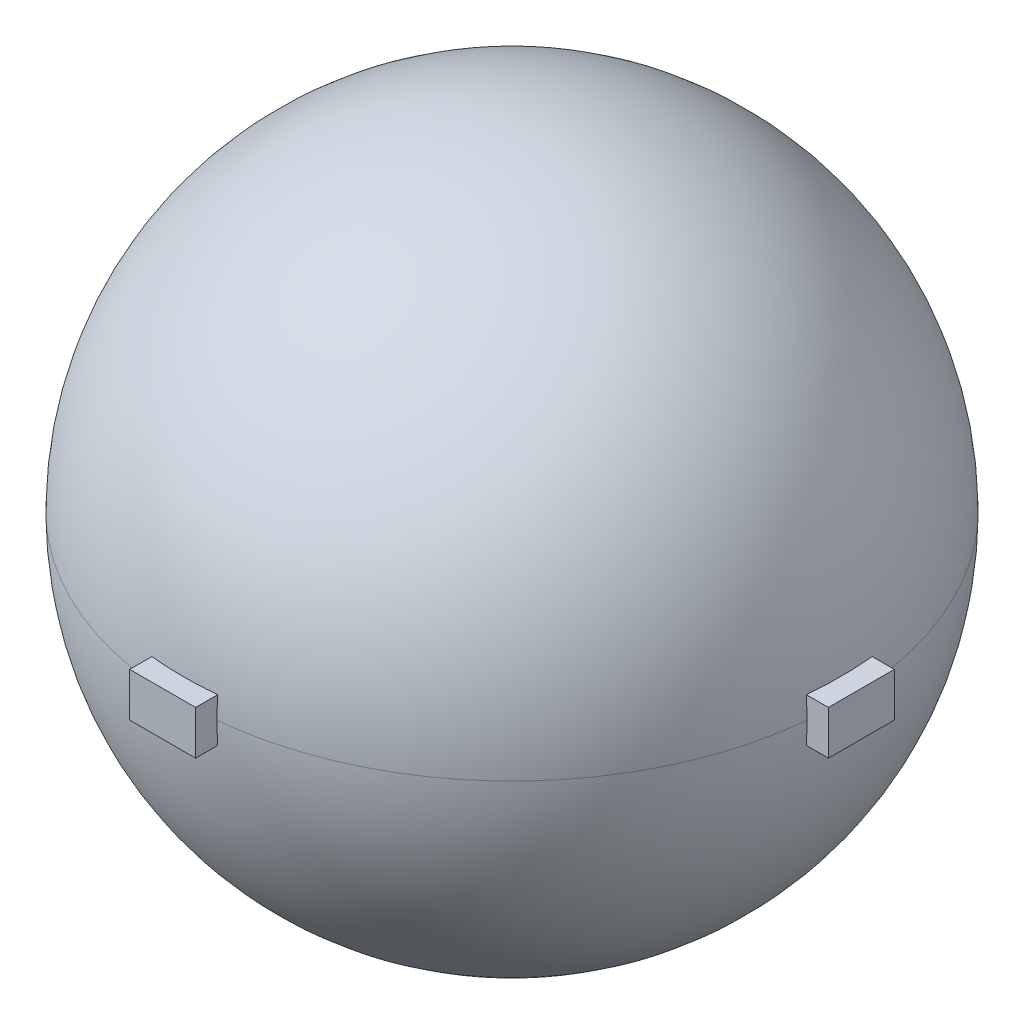
ISO-10303-21;
HEADER;
FILE_DESCRIPTION(('STEP AP214'),'2;1');
FILE_NAME('part.step','',(''),(''),'','','');
FILE_SCHEMA(('AUTOMOTIVE_DESIGN { 1 0 10303 214 1 1 1 1 }'));
ENDSEC;
DATA;
#1=APPLICATION_CONTEXT('core data for automotive mechanical design processes');
#2=APPLICATION_PROTOCOL_DEFINITION('international standard','automotive_design',2000,#1);
#3=PRODUCT_CONTEXT('',#1,'mechanical');
#4=PRODUCT('Part','Part','',(#3));
#5=PRODUCT_RELATED_PRODUCT_CATEGORY('part','',(#4));
#6=PRODUCT_DEFINITION_FORMATION('','',#4);
#7=PRODUCT_DEFINITION_CONTEXT('part definition',#1,'design');
#8=PRODUCT_DEFINITION('design','',#6,#7);
#9=PRODUCT_DEFINITION_SHAPE('','',#8);
#10=(LENGTH_UNIT() NAMED_UNIT(*) SI_UNIT(.MILLI.,.METRE.));
#11=(NAMED_UNIT(*) PLANE_ANGLE_UNIT() SI_UNIT($,.RADIAN.));
#12=(NAMED_UNIT(*) SI_UNIT($,.STERADIAN.) SOLID_ANGLE_UNIT());
#13=UNCERTAINTY_MEASURE_WITH_UNIT(LENGTH_MEASURE(1.E-05),#10,'distance_accuracy_value','');
#14=(GEOMETRIC_REPRESENTATION_CONTEXT(3) GLOBAL_UNCERTAINTY_ASSIGNED_CONTEXT((#13)) GLOBAL_UNIT_ASSIGNED_CONTEXT((#10,
#11,#12)) REPRESENTATION_CONTEXT('',''));
#15=CARTESIAN_POINT('',(0.,0.,0.));
#16=DIRECTION('',(0.,0.,1.));
#17=DIRECTION('',(1.,0.,0.));
#18=AXIS2_PLACEMENT_3D('',#15,#16,#17);
#19=CARTESIAN_POINT('',(0.,381.,0.));
#20=DIRECTION('',(0.,1.,0.));
#21=DIRECTION('',(0.,0.,1.));
#22=AXIS2_PLACEMENT_3D('',#19,#20,#21);
#23=SPHERICAL_SURFACE('',#22,381.);
#24=CARTESIAN_POINT('',(0.,381.,0.));
#25=DIRECTION('',(0.,-1.,0.));
#26=DIRECTION('',(0.,0.,-1.));
#27=AXIS2_PLACEMENT_3D('',#24,#25,#26);
#28=CIRCLE('',#27,381.);
#29=CARTESIAN_POINT('',(38.1,381.,-379.090213537622));
#30=VERTEX_POINT('',#29);
#31=CARTESIAN_POINT('',(379.090213537622,381.,-38.0999999999999));
#32=VERTEX_POINT('',#31);
#33=EDGE_CURVE('E300',#30,#32,#28,.T.);
#34=ORIENTED_EDGE('',*,*,#33,.F.);
#35=CARTESIAN_POINT('',(38.1,381.,0.));
#36=DIRECTION('',(-1.,0.,0.));
#37=DIRECTION('',(0.,0.,1.));
#38=AXIS2_PLACEMENT_3D('',#35,#36,#37);
#39=CIRCLE('',#38,379.090213537622);
#40=CARTESIAN_POINT('',(38.1,406.4,-378.23832434062));
#41=VERTEX_POINT('',#40);
#42=EDGE_CURVE('E202',#41,#30,#39,.T.);
#43=ORIENTED_EDGE('',*,*,#42,.F.);
#44=CARTESIAN_POINT('',(0.,406.4,0.));
#45=DIRECTION('',(0.,-1.,0.));
#46=DIRECTION('',(0.,0.,-1.));
#47=AXIS2_PLACEMENT_3D('',#44,#45,#46);
#48=CIRCLE('',#47,380.152390496232);
#49=CARTESIAN_POINT('',(-38.1,406.4,-378.23832434062));
#50=VERTEX_POINT('',#49);
#51=EDGE_CURVE('E195',#50,#41,#48,.T.);
#52=ORIENTED_EDGE('',*,*,#51,.F.);
#53=CARTESIAN_POINT('',(-38.1,381.,0.));
#54=DIRECTION('',(1.,0.,0.));
#55=DIRECTION('',(0.,0.,-1.));
#56=AXIS2_PLACEMENT_3D('',#53,#54,#55);
#57=CIRCLE('',#56,379.090213537622);
#58=CARTESIAN_POINT('',(-38.1,381.,-379.090213537622));
#59=VERTEX_POINT('',#58);
#60=EDGE_CURVE('E179',#59,#50,#57,.T.);
#61=ORIENTED_EDGE('',*,*,#60,.F.);
#62=CARTESIAN_POINT('',(-379.090213537622,381.,-38.0999999999999));
#63=VERTEX_POINT('',#62);
#64=EDGE_CURVE('E312',#63,#59,#28,.T.);
#65=ORIENTED_EDGE('',*,*,#64,.F.);
#66=CARTESIAN_POINT('',(0.,381.,-38.0999999999999));
#67=DIRECTION('',(0.,0.,1.));
#68=DIRECTION('',(1.,0.,0.));
#69=AXIS2_PLACEMENT_3D('',#66,#67,#68);
#70=CIRCLE('',#69,379.090213537622);
#71=CARTESIAN_POINT('',(-378.23832434062,406.4,-38.0999999999999));
#72=VERTEX_POINT('',#71);
#73=EDGE_CURVE('E253',#72,#63,#70,.T.);
#74=ORIENTED_EDGE('',*,*,#73,.F.);
#75=CARTESIAN_POINT('',(0.,406.4,0.));
#76=DIRECTION('',(0.,-1.,0.));
#77=DIRECTION('',(0.,0.,-1.));
#78=AXIS2_PLACEMENT_3D('',#75,#76,#77);
#79=CIRCLE('',#78,380.152390496232);
#80=CARTESIAN_POINT('',(-378.23832434062,406.4,38.1000000000001));
#81=VERTEX_POINT('',#80);
#82=EDGE_CURVE('E249',#81,#72,#79,.T.);
#83=ORIENTED_EDGE('',*,*,#82,.F.);
#84=CARTESIAN_POINT('',(0.,381.,38.1000000000001));
#85=DIRECTION('',(0.,0.,-1.));
#86=DIRECTION('',(-1.,0.,0.));
#87=AXIS2_PLACEMENT_3D('',#84,#85,#86);
#88=CIRCLE('',#87,379.090213537622);
#89=CARTESIAN_POINT('',(-379.090213537622,381.,38.1000000000001));
#90=VERTEX_POINT('',#89);
#91=EDGE_CURVE('E250',#90,#81,#88,.T.);
#92=ORIENTED_EDGE('',*,*,#91,.F.);
#93=CARTESIAN_POINT('',(-38.1,381.,379.090213537622));
#94=VERTEX_POINT('',#93);
#95=EDGE_CURVE('E311',#94,#90,#28,.T.);
#96=ORIENTED_EDGE('',*,*,#95,.F.);
#97=CARTESIAN_POINT('',(-38.1,381.,0.));
#98=DIRECTION('',(-1.,0.,0.));
#99=DIRECTION('',(0.,0.,1.));
#100=AXIS2_PLACEMENT_3D('',#97,#98,#99);
#101=CIRCLE('',#100,379.090213537622);
#102=CARTESIAN_POINT('',(-38.1,406.4,378.23832434062));
#103=VERTEX_POINT('',#102);
#104=EDGE_CURVE('E64',#94,#103,#101,.T.);
#105=ORIENTED_EDGE('',*,*,#104,.T.);
#106=CARTESIAN_POINT('',(0.,406.4,0.));
#107=DIRECTION('',(0.,1.,0.));
#108=DIRECTION('',(0.,0.,1.));
#109=AXIS2_PLACEMENT_3D('',#106,#107,#108);
#110=CIRCLE('',#109,380.152390496232);
#111=CARTESIAN_POINT('',(38.1,406.4,378.23832434062));
#112=VERTEX_POINT('',#111);
#113=EDGE_CURVE('E223',#103,#112,#110,.T.);
#114=ORIENTED_EDGE('',*,*,#113,.T.);
#115=CARTESIAN_POINT('',(38.1,381.,0.));
#116=DIRECTION('',(1.,0.,0.));
#117=DIRECTION('',(0.,0.,-1.));
#118=AXIS2_PLACEMENT_3D('',#115,#116,#117);
#119=CIRCLE('',#118,379.090213537622);
#120=CARTESIAN_POINT('',(38.1,381.,379.090213537622));
#121=VERTEX_POINT('',#120);
#122=EDGE_CURVE('E220',#112,#121,#119,.T.);
#123=ORIENTED_EDGE('',*,*,#122,.T.);
#124=CARTESIAN_POINT('',(379.090213537622,381.,38.1000000000001));
#125=VERTEX_POINT('',#124);
#126=EDGE_CURVE('E308',#125,#121,#28,.T.);
#127=ORIENTED_EDGE('',*,*,#126,.F.);
#128=CARTESIAN_POINT('',(0.,381.,38.1000000000001));
#129=DIRECTION('',(0.,0.,1.));
#130=DIRECTION('',(1.,0.,0.));
#131=AXIS2_PLACEMENT_3D('',#128,#129,#130);
#132=CIRCLE('',#131,379.090213537622);
#133=CARTESIAN_POINT('',(378.23832434062,406.4,38.1000000000001));
#134=VERTEX_POINT('',#133);
#135=EDGE_CURVE('E303',#125,#134,#132,.T.);
#136=ORIENTED_EDGE('',*,*,#135,.T.);
#137=CARTESIAN_POINT('',(0.,406.4,0.));
#138=DIRECTION('',(0.,1.,0.));
#139=DIRECTION('',(0.,0.,1.));
#140=AXIS2_PLACEMENT_3D('',#137,#138,#139);
#141=CIRCLE('',#140,380.152390496232);
#142=CARTESIAN_POINT('',(378.23832434062,406.4,-38.0999999999999));
#143=VERTEX_POINT('',#142);
#144=EDGE_CURVE('E298',#134,#143,#141,.T.);
#145=ORIENTED_EDGE('',*,*,#144,.T.);
#146=CARTESIAN_POINT('',(0.,381.,-38.0999999999999));
#147=DIRECTION('',(0.,0.,-1.));
#148=DIRECTION('',(-1.,0.,0.));
#149=AXIS2_PLACEMENT_3D('',#146,#147,#148);
#150=CIRCLE('',#149,379.090213537622);
#151=EDGE_CURVE('E281',#143,#32,#150,.T.);
#152=ORIENTED_EDGE('',*,*,#151,.T.);
#153=EDGE_LOOP('',(#34,#43,#52,#61,#65,#74,#83,#92,#96,#105,#114,#123,#127,#136,#145,#152));
#154=FACE_BOUND('',#153,.T.);
#155=ADVANCED_FACE('F40',(#154),#23,.T.);
#156=CARTESIAN_POINT('',(0.,381.,0.));
#157=DIRECTION('',(0.,1.,0.));
#158=DIRECTION('',(0.,0.,1.));
#159=AXIS2_PLACEMENT_3D('',#156,#157,#158);
#160=SPHERICAL_SURFACE('',#159,381.);
#161=CARTESIAN_POINT('',(0.,355.6,0.));
#162=DIRECTION('',(0.,1.,0.));
#163=DIRECTION('',(0.,0.,1.));
#164=AXIS2_PLACEMENT_3D('',#161,#162,#163);
#165=CIRCLE('',#164,380.152390496232);
#166=CARTESIAN_POINT('',(38.1,355.6,-378.23832434062));
#167=VERTEX_POINT('',#166);
#168=CARTESIAN_POINT('',(-38.1,355.6,-378.23832434062));
#169=VERTEX_POINT('',#168);
#170=EDGE_CURVE('E56',#167,#169,#165,.T.);
#171=ORIENTED_EDGE('',*,*,#170,.F.);
#172=CARTESIAN_POINT('',(38.1,381.,0.));
#173=DIRECTION('',(-1.,0.,0.));
#174=DIRECTION('',(0.,0.,1.));
#175=AXIS2_PLACEMENT_3D('',#172,#173,#174);
#176=CIRCLE('',#175,379.090213537622);
#177=EDGE_CURVE('E11',#167,#30,#176,.F.);
#178=ORIENTED_EDGE('',*,*,#177,.T.);
#179=ORIENTED_EDGE('',*,*,#33,.T.);
#180=CARTESIAN_POINT('',(0.,381.,-38.0999999999999));
#181=DIRECTION('',(0.,0.,-1.));
#182=DIRECTION('',(-1.,0.,0.));
#183=AXIS2_PLACEMENT_3D('',#180,#181,#182);
#184=CIRCLE('',#183,379.090213537622);
#185=CARTESIAN_POINT('',(378.23832434062,355.6,-38.0999999999999));
#186=VERTEX_POINT('',#185);
#187=EDGE_CURVE('E315',#186,#32,#184,.F.);
#188=ORIENTED_EDGE('',*,*,#187,.F.);
#189=CARTESIAN_POINT('',(0.,355.6,0.));
#190=DIRECTION('',(0.,-1.,0.));
#191=DIRECTION('',(0.,0.,-1.));
#192=AXIS2_PLACEMENT_3D('',#189,#190,#191);
#193=CIRCLE('',#192,380.152390496232);
#194=CARTESIAN_POINT('',(378.23832434062,355.6,38.1000000000001));
#195=VERTEX_POINT('',#194);
#196=EDGE_CURVE('E304',#186,#195,#193,.T.);
#197=ORIENTED_EDGE('',*,*,#196,.T.);
#198=EDGE_CURVE('E301',#195,#125,#132,.T.);
#199=ORIENTED_EDGE('',*,*,#198,.T.);
#200=ORIENTED_EDGE('',*,*,#126,.T.);
#201=CARTESIAN_POINT('',(38.1,381.,0.));
#202=DIRECTION('',(1.,0.,0.));
#203=DIRECTION('',(0.,0.,-1.));
#204=AXIS2_PLACEMENT_3D('',#201,#202,#203);
#205=CIRCLE('',#204,379.090213537622);
#206=CARTESIAN_POINT('',(38.1,355.6,378.23832434062));
#207=VERTEX_POINT('',#206);
#208=EDGE_CURVE('E49',#207,#121,#205,.F.);
#209=ORIENTED_EDGE('',*,*,#208,.F.);
#210=CARTESIAN_POINT('',(0.,355.6,0.));
#211=DIRECTION('',(0.,-1.,0.));
#212=DIRECTION('',(0.,0.,-1.));
#213=AXIS2_PLACEMENT_3D('',#210,#211,#212);
#214=CIRCLE('',#213,380.152390496232);
#215=CARTESIAN_POINT('',(-38.1,355.6,378.23832434062));
#216=VERTEX_POINT('',#215);
#217=EDGE_CURVE('E218',#207,#216,#214,.T.);
#218=ORIENTED_EDGE('',*,*,#217,.T.);
#219=EDGE_CURVE('E216',#216,#94,#101,.T.);
#220=ORIENTED_EDGE('',*,*,#219,.T.);
#221=ORIENTED_EDGE('',*,*,#95,.T.);
#222=CARTESIAN_POINT('',(-378.23832434062,355.6,38.1000000000001));
#223=VERTEX_POINT('',#222);
#224=EDGE_CURVE('E246',#223,#90,#88,.T.);
#225=ORIENTED_EDGE('',*,*,#224,.F.);
#226=CARTESIAN_POINT('',(0.,355.6,0.));
#227=DIRECTION('',(0.,1.,0.));
#228=DIRECTION('',(0.,0.,1.));
#229=AXIS2_PLACEMENT_3D('',#226,#227,#228);
#230=CIRCLE('',#229,380.152390496232);
#231=CARTESIAN_POINT('',(-378.23832434062,355.6,-38.0999999999999));
#232=VERTEX_POINT('',#231);
#233=EDGE_CURVE('E270',#232,#223,#230,.T.);
#234=ORIENTED_EDGE('',*,*,#233,.F.);
#235=CARTESIAN_POINT('',(0.,381.,-38.0999999999999));
#236=DIRECTION('',(0.,0.,1.));
#237=DIRECTION('',(1.,0.,0.));
#238=AXIS2_PLACEMENT_3D('',#235,#236,#237);
#239=CIRCLE('',#238,379.090213537622);
#240=EDGE_CURVE('E318',#232,#63,#239,.F.);
#241=ORIENTED_EDGE('',*,*,#240,.T.);
#242=ORIENTED_EDGE('',*,*,#64,.T.);
#243=EDGE_CURVE('E186',#169,#59,#57,.T.);
#244=ORIENTED_EDGE('',*,*,#243,.F.);
#245=EDGE_LOOP('',(#171,#178,#179,#188,#197,#199,#200,#209,#218,#220,#221,#225,#234,#241,#242,#244));
#246=FACE_BOUND('',#245,.T.);
#247=ADVANCED_FACE('F329',(#246),#160,.T.);
#248=CARTESIAN_POINT('',(-381.001,355.6,-38.0999999999999));
#249=DIRECTION('',(0.,0.,-1.));
#250=DIRECTION('',(-1.,0.,0.));
#251=AXIS2_PLACEMENT_3D('',#248,#249,#250);
#252=PLANE('',#251);
#253=ORIENTED_EDGE('',*,*,#151,.F.);
#254=DIRECTION('',(1.,0.,0.));
#255=VECTOR('',#254,1.);
#256=CARTESIAN_POINT('',(-381.001,406.4,-38.0999999999999));
#257=LINE('',#256,#255);
#258=CARTESIAN_POINT('',(403.86,406.4,-38.0999999999999));
#259=VERTEX_POINT('',#258);
#260=EDGE_CURVE('E255',#143,#259,#257,.T.);
#261=ORIENTED_EDGE('',*,*,#260,.T.);
#262=DIRECTION('',(0.,1.,0.));
#263=VECTOR('',#262,1.);
#264=CARTESIAN_POINT('',(403.86,355.6,-38.0999999999999));
#265=LINE('',#264,#263);
#266=CARTESIAN_POINT('',(403.86,355.6,-38.0999999999999));
#267=VERTEX_POINT('',#266);
#268=EDGE_CURVE('E288',#267,#259,#265,.T.);
#269=ORIENTED_EDGE('',*,*,#268,.F.);
#270=DIRECTION('',(1.,0.,0.));
#271=VECTOR('',#270,1.);
#272=CARTESIAN_POINT('',(-381.001,355.6,-38.0999999999999));
#273=LINE('',#272,#271);
#274=EDGE_CURVE('E292',#186,#267,#273,.T.);
#275=ORIENTED_EDGE('',*,*,#274,.F.);
#276=ORIENTED_EDGE('',*,*,#187,.T.);
#277=EDGE_LOOP('',(#253,#261,#269,#275,#276));
#278=FACE_BOUND('',#277,.T.);
#279=ADVANCED_FACE('F359',(#278),#252,.T.);
#280=CARTESIAN_POINT('',(-381.001,355.6,38.1000000000001));
#281=DIRECTION('',(0.,-1.,0.));
#282=DIRECTION('',(0.,0.,-1.));
#283=AXIS2_PLACEMENT_3D('',#280,#281,#282);
#284=PLANE('',#283);
#285=ORIENTED_EDGE('',*,*,#196,.F.);
#286=ORIENTED_EDGE('',*,*,#274,.T.);
#287=DIRECTION('',(0.,0.,-1.));
#288=VECTOR('',#287,1.);
#289=CARTESIAN_POINT('',(403.86,355.6,38.1000000000001));
#290=LINE('',#289,#288);
#291=CARTESIAN_POINT('',(403.86,355.6,38.1000000000001));
#292=VERTEX_POINT('',#291);
#293=EDGE_CURVE('E278',#292,#267,#290,.T.);
#294=ORIENTED_EDGE('',*,*,#293,.F.);
#295=DIRECTION('',(1.,0.,0.));
#296=VECTOR('',#295,1.);
#297=CARTESIAN_POINT('',(-381.001,355.6,38.1000000000001));
#298=LINE('',#297,#296);
#299=EDGE_CURVE('E291',#195,#292,#298,.T.);
#300=ORIENTED_EDGE('',*,*,#299,.F.);
#301=EDGE_LOOP('',(#285,#286,#294,#300));
#302=FACE_BOUND('',#301,.T.);
#303=ADVANCED_FACE('F364',(#302),#284,.T.);
#304=CARTESIAN_POINT('',(-381.001,406.4,38.1000000000001));
#305=DIRECTION('',(0.,1.,0.));
#306=DIRECTION('',(0.,0.,1.));
#307=AXIS2_PLACEMENT_3D('',#304,#305,#306);
#308=PLANE('',#307);
#309=ORIENTED_EDGE('',*,*,#144,.F.);
#310=DIRECTION('',(1.,0.,0.));
#311=VECTOR('',#310,1.);
#312=CARTESIAN_POINT('',(-381.001,406.4,38.1000000000001));
#313=LINE('',#312,#311);
#314=CARTESIAN_POINT('',(403.86,406.4,38.1000000000001));
#315=VERTEX_POINT('',#314);
#316=EDGE_CURVE('E294',#134,#315,#313,.T.);
#317=ORIENTED_EDGE('',*,*,#316,.T.);
#318=DIRECTION('',(0.,0.,1.));
#319=VECTOR('',#318,1.);
#320=CARTESIAN_POINT('',(403.86,406.4,38.1000000000001));
#321=LINE('',#320,#319);
#322=EDGE_CURVE('E285',#259,#315,#321,.T.);
#323=ORIENTED_EDGE('',*,*,#322,.F.);
#324=ORIENTED_EDGE('',*,*,#260,.F.);
#325=EDGE_LOOP('',(#309,#317,#323,#324));
#326=FACE_BOUND('',#325,.T.);
#327=ADVANCED_FACE('F356',(#326),#308,.T.);
#328=CARTESIAN_POINT('',(-381.001,355.6,38.1000000000001));
#329=DIRECTION('',(0.,0.,1.));
#330=DIRECTION('',(1.,0.,0.));
#331=AXIS2_PLACEMENT_3D('',#328,#329,#330);
#332=PLANE('',#331);
#333=ORIENTED_EDGE('',*,*,#198,.F.);
#334=ORIENTED_EDGE('',*,*,#299,.T.);
#335=DIRECTION('',(0.,-1.,0.));
#336=VECTOR('',#335,1.);
#337=CARTESIAN_POINT('',(403.86,355.6,38.1000000000001));
#338=LINE('',#337,#336);
#339=EDGE_CURVE('E282',#315,#292,#338,.T.);
#340=ORIENTED_EDGE('',*,*,#339,.F.);
#341=ORIENTED_EDGE('',*,*,#316,.F.);
#342=ORIENTED_EDGE('',*,*,#135,.F.);
#343=EDGE_LOOP('',(#333,#334,#340,#341,#342));
#344=FACE_BOUND('',#343,.T.);
#345=ADVANCED_FACE('F349',(#344),#332,.T.);
#346=CARTESIAN_POINT('',(403.86,0.,0.));
#347=DIRECTION('',(-1.,0.,0.));
#348=DIRECTION('',(0.,0.,1.));
#349=AXIS2_PLACEMENT_3D('',#346,#347,#348);
#350=PLANE('',#349);
#351=ORIENTED_EDGE('',*,*,#268,.T.);
#352=ORIENTED_EDGE('',*,*,#322,.T.);
#353=ORIENTED_EDGE('',*,*,#339,.T.);
#354=ORIENTED_EDGE('',*,*,#293,.T.);
#355=EDGE_LOOP('',(#351,#352,#353,#354));
#356=FACE_BOUND('',#355,.T.);
#357=ADVANCED_FACE('F367',(#356),#350,.F.);
#358=CARTESIAN_POINT('',(-403.86,0.,0.));
#359=DIRECTION('',(1.,0.,0.));
#360=DIRECTION('',(0.,0.,1.));
#361=AXIS2_PLACEMENT_3D('',#358,#359,#360);
#362=PLANE('',#361);
#363=DIRECTION('',(0.,1.,0.));
#364=VECTOR('',#363,1.);
#365=CARTESIAN_POINT('',(-403.86,355.6,-38.0999999999999));
#366=LINE('',#365,#364);
#367=CARTESIAN_POINT('',(-403.86,355.6,-38.0999999999999));
#368=VERTEX_POINT('',#367);
#369=CARTESIAN_POINT('',(-403.86,406.4,-38.0999999999999));
#370=VERTEX_POINT('',#369);
#371=EDGE_CURVE('E245',#368,#370,#366,.T.);
#372=ORIENTED_EDGE('',*,*,#371,.F.);
#373=DIRECTION('',(0.,0.,-1.));
#374=VECTOR('',#373,1.);
#375=CARTESIAN_POINT('',(-403.86,355.6,38.1000000000001));
#376=LINE('',#375,#374);
#377=CARTESIAN_POINT('',(-403.86,355.6,38.1000000000001));
#378=VERTEX_POINT('',#377);
#379=EDGE_CURVE('E258',#378,#368,#376,.T.);
#380=ORIENTED_EDGE('',*,*,#379,.F.);
#381=DIRECTION('',(0.,-1.,0.));
#382=VECTOR('',#381,1.);
#383=CARTESIAN_POINT('',(-403.86,355.6,38.1000000000001));
#384=LINE('',#383,#382);
#385=CARTESIAN_POINT('',(-403.86,406.4,38.1000000000001));
#386=VERTEX_POINT('',#385);
#387=EDGE_CURVE('E261',#386,#378,#384,.T.);
#388=ORIENTED_EDGE('',*,*,#387,.F.);
#389=DIRECTION('',(0.,0.,1.));
#390=VECTOR('',#389,1.);
#391=CARTESIAN_POINT('',(-403.86,406.4,38.1000000000001));
#392=LINE('',#391,#390);
#393=EDGE_CURVE('E264',#370,#386,#392,.T.);
#394=ORIENTED_EDGE('',*,*,#393,.F.);
#395=EDGE_LOOP('',(#372,#380,#388,#394));
#396=FACE_BOUND('',#395,.T.);
#397=ADVANCED_FACE('F369',(#396),#362,.F.);
#398=CARTESIAN_POINT('',(403.861,355.6,38.1000000000001));
#399=DIRECTION('',(0.,1.,0.));
#400=DIRECTION('',(0.,0.,1.));
#401=AXIS2_PLACEMENT_3D('',#398,#399,#400);
#402=PLANE('',#401);
#403=DIRECTION('',(-1.,0.,0.));
#404=VECTOR('',#403,1.);
#405=CARTESIAN_POINT('',(403.861,355.6,-38.0999999999999));
#406=LINE('',#405,#404);
#407=EDGE_CURVE('E267',#232,#368,#406,.T.);
#408=ORIENTED_EDGE('',*,*,#407,.F.);
#409=ORIENTED_EDGE('',*,*,#233,.T.);
#410=DIRECTION('',(-1.,0.,0.));
#411=VECTOR('',#410,1.);
#412=CARTESIAN_POINT('',(403.861,355.6,38.1000000000001));
#413=LINE('',#412,#411);
#414=EDGE_CURVE('E273',#223,#378,#413,.T.);
#415=ORIENTED_EDGE('',*,*,#414,.T.);
#416=ORIENTED_EDGE('',*,*,#379,.T.);
#417=EDGE_LOOP('',(#408,#409,#415,#416));
#418=FACE_BOUND('',#417,.T.);
#419=ADVANCED_FACE('F375',(#418),#402,.F.);
#420=CARTESIAN_POINT('',(403.861,355.6,38.1000000000001));
#421=DIRECTION('',(0.,0.,-1.));
#422=DIRECTION('',(-1.,0.,0.));
#423=AXIS2_PLACEMENT_3D('',#420,#421,#422);
#424=PLANE('',#423);
#425=ORIENTED_EDGE('',*,*,#414,.F.);
#426=ORIENTED_EDGE('',*,*,#224,.T.);
#427=ORIENTED_EDGE('',*,*,#91,.T.);
#428=DIRECTION('',(-1.,0.,0.));
#429=VECTOR('',#428,1.);
#430=CARTESIAN_POINT('',(403.861,406.4,38.1000000000001));
#431=LINE('',#430,#429);
#432=EDGE_CURVE('E271',#81,#386,#431,.T.);
#433=ORIENTED_EDGE('',*,*,#432,.T.);
#434=ORIENTED_EDGE('',*,*,#387,.T.);
#435=EDGE_LOOP('',(#425,#426,#427,#433,#434));
#436=FACE_BOUND('',#435,.T.);
#437=ADVANCED_FACE('F449',(#436),#424,.F.);
#438=CARTESIAN_POINT('',(403.861,406.4,38.1000000000001));
#439=DIRECTION('',(0.,-1.,0.));
#440=DIRECTION('',(0.,0.,-1.));
#441=AXIS2_PLACEMENT_3D('',#438,#439,#440);
#442=PLANE('',#441);
#443=ORIENTED_EDGE('',*,*,#432,.F.);
#444=ORIENTED_EDGE('',*,*,#82,.T.);
#445=DIRECTION('',(-1.,0.,0.));
#446=VECTOR('',#445,1.);
#447=CARTESIAN_POINT('',(403.861,406.4,-38.0999999999999));
#448=LINE('',#447,#446);
#449=EDGE_CURVE('E268',#72,#370,#448,.T.);
#450=ORIENTED_EDGE('',*,*,#449,.T.);
#451=ORIENTED_EDGE('',*,*,#393,.T.);
#452=EDGE_LOOP('',(#443,#444,#450,#451));
#453=FACE_BOUND('',#452,.T.);
#454=ADVANCED_FACE('F459',(#453),#442,.F.);
#455=CARTESIAN_POINT('',(403.861,355.6,-38.0999999999999));
#456=DIRECTION('',(0.,0.,1.));
#457=DIRECTION('',(1.,0.,0.));
#458=AXIS2_PLACEMENT_3D('',#455,#456,#457);
#459=PLANE('',#458);
#460=ORIENTED_EDGE('',*,*,#449,.F.);
#461=ORIENTED_EDGE('',*,*,#73,.T.);
#462=ORIENTED_EDGE('',*,*,#240,.F.);
#463=ORIENTED_EDGE('',*,*,#407,.T.);
#464=ORIENTED_EDGE('',*,*,#371,.T.);
#465=EDGE_LOOP('',(#460,#461,#462,#463,#464));
#466=FACE_BOUND('',#465,.T.);
#467=ADVANCED_FACE('F469',(#466),#459,.F.);
#468=CARTESIAN_POINT('',(0.,0.,403.86));
#469=DIRECTION('',(0.,0.,-1.));
#470=DIRECTION('',(-1.,0.,0.));
#471=AXIS2_PLACEMENT_3D('',#468,#469,#470);
#472=PLANE('',#471);
#473=DIRECTION('',(0.,1.,0.));
#474=VECTOR('',#473,1.);
#475=CARTESIAN_POINT('',(38.1,355.6,403.86));
#476=LINE('',#475,#474);
#477=CARTESIAN_POINT('',(38.1,355.6,403.86));
#478=VERTEX_POINT('',#477);
#479=CARTESIAN_POINT('',(38.1,406.4,403.86));
#480=VERTEX_POINT('',#479);
#481=EDGE_CURVE('E224',#478,#480,#476,.T.);
#482=ORIENTED_EDGE('',*,*,#481,.T.);
#483=DIRECTION('',(-1.,0.,0.));
#484=VECTOR('',#483,1.);
#485=CARTESIAN_POINT('',(-38.1,406.4,403.86));
#486=LINE('',#485,#484);
#487=CARTESIAN_POINT('',(-38.1,406.4,403.86));
#488=VERTEX_POINT('',#487);
#489=EDGE_CURVE('E227',#480,#488,#486,.T.);
#490=ORIENTED_EDGE('',*,*,#489,.T.);
#491=DIRECTION('',(0.,-1.,0.));
#492=VECTOR('',#491,1.);
#493=CARTESIAN_POINT('',(-38.1,355.6,403.86));
#494=LINE('',#493,#492);
#495=CARTESIAN_POINT('',(-38.1,355.6,403.86));
#496=VERTEX_POINT('',#495);
#497=EDGE_CURVE('E230',#488,#496,#494,.T.);
#498=ORIENTED_EDGE('',*,*,#497,.T.);
#499=DIRECTION('',(1.,0.,0.));
#500=VECTOR('',#499,1.);
#501=CARTESIAN_POINT('',(-38.1,355.6,403.86));
#502=LINE('',#501,#500);
#503=EDGE_CURVE('E233',#496,#478,#502,.T.);
#504=ORIENTED_EDGE('',*,*,#503,.T.);
#505=EDGE_LOOP('',(#482,#490,#498,#504));
#506=FACE_BOUND('',#505,.T.);
#507=ADVANCED_FACE('F340',(#506),#472,.F.);
#508=CARTESIAN_POINT('',(-38.1,406.4,-381.001));
#509=DIRECTION('',(0.,1.,0.));
#510=DIRECTION('',(0.,0.,1.));
#511=AXIS2_PLACEMENT_3D('',#508,#509,#510);
#512=PLANE('',#511);
#513=ORIENTED_EDGE('',*,*,#113,.F.);
#514=DIRECTION('',(0.,0.,1.));
#515=VECTOR('',#514,1.);
#516=CARTESIAN_POINT('',(-38.1,406.4,-381.001));
#517=LINE('',#516,#515);
#518=EDGE_CURVE('E241',#103,#488,#517,.T.);
#519=ORIENTED_EDGE('',*,*,#518,.T.);
#520=ORIENTED_EDGE('',*,*,#489,.F.);
#521=DIRECTION('',(0.,0.,1.));
#522=VECTOR('',#521,1.);
#523=CARTESIAN_POINT('',(38.1,406.4,-381.001));
#524=LINE('',#523,#522);
#525=EDGE_CURVE('E236',#112,#480,#524,.T.);
#526=ORIENTED_EDGE('',*,*,#525,.F.);
#527=EDGE_LOOP('',(#513,#519,#520,#526));
#528=FACE_BOUND('',#527,.T.);
#529=ADVANCED_FACE('F344',(#528),#512,.T.);
#530=CARTESIAN_POINT('',(-38.1,355.6,-381.001));
#531=DIRECTION('',(-1.,0.,0.));
#532=DIRECTION('',(0.,0.,1.));
#533=AXIS2_PLACEMENT_3D('',#530,#531,#532);
#534=PLANE('',#533);
#535=ORIENTED_EDGE('',*,*,#219,.F.);
#536=DIRECTION('',(0.,0.,1.));
#537=VECTOR('',#536,1.);
#538=CARTESIAN_POINT('',(-38.1,355.6,-381.001));
#539=LINE('',#538,#537);
#540=EDGE_CURVE('E239',#216,#496,#539,.T.);
#541=ORIENTED_EDGE('',*,*,#540,.T.);
#542=ORIENTED_EDGE('',*,*,#497,.F.);
#543=ORIENTED_EDGE('',*,*,#518,.F.);
#544=ORIENTED_EDGE('',*,*,#104,.F.);
#545=EDGE_LOOP('',(#535,#541,#542,#543,#544));
#546=FACE_BOUND('',#545,.T.);
#547=ADVANCED_FACE('F338',(#546),#534,.T.);
#548=CARTESIAN_POINT('',(-38.1,355.6,-381.001));
#549=DIRECTION('',(0.,-1.,0.));
#550=DIRECTION('',(0.,0.,-1.));
#551=AXIS2_PLACEMENT_3D('',#548,#549,#550);
#552=PLANE('',#551);
#553=ORIENTED_EDGE('',*,*,#217,.F.);
#554=DIRECTION('',(0.,0.,1.));
#555=VECTOR('',#554,1.);
#556=CARTESIAN_POINT('',(38.1,355.6,-381.001));
#557=LINE('',#556,#555);
#558=EDGE_CURVE('E237',#207,#478,#557,.T.);
#559=ORIENTED_EDGE('',*,*,#558,.T.);
#560=ORIENTED_EDGE('',*,*,#503,.F.);
#561=ORIENTED_EDGE('',*,*,#540,.F.);
#562=EDGE_LOOP('',(#553,#559,#560,#561));
#563=FACE_BOUND('',#562,.T.);
#564=ADVANCED_FACE('F334',(#563),#552,.T.);
#565=CARTESIAN_POINT('',(38.1,355.6,-381.001));
#566=DIRECTION('',(1.,0.,0.));
#567=DIRECTION('',(0.,0.,-1.));
#568=AXIS2_PLACEMENT_3D('',#565,#566,#567);
#569=PLANE('',#568);
#570=ORIENTED_EDGE('',*,*,#122,.F.);
#571=ORIENTED_EDGE('',*,*,#525,.T.);
#572=ORIENTED_EDGE('',*,*,#481,.F.);
#573=ORIENTED_EDGE('',*,*,#558,.F.);
#574=ORIENTED_EDGE('',*,*,#208,.T.);
#575=EDGE_LOOP('',(#570,#571,#572,#573,#574));
#576=FACE_BOUND('',#575,.T.);
#577=ADVANCED_FACE('F324',(#576),#569,.T.);
#578=CARTESIAN_POINT('',(38.1,355.6,403.861));
#579=DIRECTION('',(-1.,0.,0.));
#580=DIRECTION('',(0.,0.,1.));
#581=AXIS2_PLACEMENT_3D('',#578,#579,#580);
#582=PLANE('',#581);
#583=DIRECTION('',(0.,0.,-1.));
#584=VECTOR('',#583,1.);
#585=CARTESIAN_POINT('',(38.1,406.4,403.861));
#586=LINE('',#585,#584);
#587=CARTESIAN_POINT('',(38.1,406.4,-403.86));
#588=VERTEX_POINT('',#587);
#589=EDGE_CURVE('E203',#41,#588,#586,.T.);
#590=ORIENTED_EDGE('',*,*,#589,.F.);
#591=ORIENTED_EDGE('',*,*,#42,.T.);
#592=ORIENTED_EDGE('',*,*,#177,.F.);
#593=DIRECTION('',(0.,0.,-1.));
#594=VECTOR('',#593,1.);
#595=CARTESIAN_POINT('',(38.1,355.6,403.861));
#596=LINE('',#595,#594);
#597=CARTESIAN_POINT('',(38.1,355.6,-403.86));
#598=VERTEX_POINT('',#597);
#599=EDGE_CURVE('E215',#167,#598,#596,.T.);
#600=ORIENTED_EDGE('',*,*,#599,.T.);
#601=DIRECTION('',(0.,1.,0.));
#602=VECTOR('',#601,1.);
#603=CARTESIAN_POINT('',(38.1,355.6,-403.86));
#604=LINE('',#603,#602);
#605=EDGE_CURVE('E213',#598,#588,#604,.T.);
#606=ORIENTED_EDGE('',*,*,#605,.T.);
#607=EDGE_LOOP('',(#590,#591,#592,#600,#606));
#608=FACE_BOUND('',#607,.T.);
#609=ADVANCED_FACE('F518',(#608),#582,.F.);
#610=CARTESIAN_POINT('',(-38.1,355.6,403.861));
#611=DIRECTION('',(0.,1.,0.));
#612=DIRECTION('',(0.,0.,1.));
#613=AXIS2_PLACEMENT_3D('',#610,#611,#612);
#614=PLANE('',#613);
#615=ORIENTED_EDGE('',*,*,#599,.F.);
#616=ORIENTED_EDGE('',*,*,#170,.T.);
#617=DIRECTION('',(0.,0.,-1.));
#618=VECTOR('',#617,1.);
#619=CARTESIAN_POINT('',(-38.1,355.6,403.861));
#620=LINE('',#619,#618);
#621=CARTESIAN_POINT('',(-38.1,355.6,-403.86));
#622=VERTEX_POINT('',#621);
#623=EDGE_CURVE('E208',#169,#622,#620,.T.);
#624=ORIENTED_EDGE('',*,*,#623,.T.);
#625=DIRECTION('',(1.,0.,0.));
#626=VECTOR('',#625,1.);
#627=CARTESIAN_POINT('',(-38.1,355.6,-403.86));
#628=LINE('',#627,#626);
#629=EDGE_CURVE('E204',#622,#598,#628,.T.);
#630=ORIENTED_EDGE('',*,*,#629,.T.);
#631=EDGE_LOOP('',(#615,#616,#624,#630));
#632=FACE_BOUND('',#631,.T.);
#633=ADVANCED_FACE('F538',(#632),#614,.F.);
#634=CARTESIAN_POINT('',(-38.1,406.4,403.861));
#635=DIRECTION('',(0.,-1.,0.));
#636=DIRECTION('',(0.,0.,-1.));
#637=AXIS2_PLACEMENT_3D('',#634,#635,#636);
#638=PLANE('',#637);
#639=DIRECTION('',(0.,0.,-1.));
#640=VECTOR('',#639,1.);
#641=CARTESIAN_POINT('',(-38.1,406.4,403.861));
#642=LINE('',#641,#640);
#643=CARTESIAN_POINT('',(-38.1,406.4,-403.86));
#644=VERTEX_POINT('',#643);
#645=EDGE_CURVE('E183',#50,#644,#642,.T.);
#646=ORIENTED_EDGE('',*,*,#645,.F.);
#647=ORIENTED_EDGE('',*,*,#51,.T.);
#648=ORIENTED_EDGE('',*,*,#589,.T.);
#649=DIRECTION('',(-1.,0.,0.));
#650=VECTOR('',#649,1.);
#651=CARTESIAN_POINT('',(-38.1,406.4,-403.86));
#652=LINE('',#651,#650);
#653=EDGE_CURVE('E190',#588,#644,#652,.T.);
#654=ORIENTED_EDGE('',*,*,#653,.T.);
#655=EDGE_LOOP('',(#646,#647,#648,#654));
#656=FACE_BOUND('',#655,.T.);
#657=ADVANCED_FACE('F194',(#656),#638,.F.);
#658=CARTESIAN_POINT('',(-38.1,355.6,403.861));
#659=DIRECTION('',(1.,0.,0.));
#660=DIRECTION('',(0.,0.,-1.));
#661=AXIS2_PLACEMENT_3D('',#658,#659,#660);
#662=PLANE('',#661);
#663=ORIENTED_EDGE('',*,*,#623,.F.);
#664=ORIENTED_EDGE('',*,*,#243,.T.);
#665=ORIENTED_EDGE('',*,*,#60,.T.);
#666=ORIENTED_EDGE('',*,*,#645,.T.);
#667=DIRECTION('',(0.,-1.,0.));
#668=VECTOR('',#667,1.);
#669=CARTESIAN_POINT('',(-38.1,355.6,-403.86));
#670=LINE('',#669,#668);
#671=EDGE_CURVE('E199',#644,#622,#670,.T.);
#672=ORIENTED_EDGE('',*,*,#671,.T.);
#673=EDGE_LOOP('',(#663,#664,#665,#666,#672));
#674=FACE_BOUND('',#673,.T.);
#675=ADVANCED_FACE('F181',(#674),#662,.F.);
#676=CARTESIAN_POINT('',(0.,0.,-403.86));
#677=DIRECTION('',(0.,0.,1.));
#678=DIRECTION('',(-1.,0.,0.));
#679=AXIS2_PLACEMENT_3D('',#676,#677,#678);
#680=PLANE('',#679);
#681=ORIENTED_EDGE('',*,*,#605,.F.);
#682=ORIENTED_EDGE('',*,*,#629,.F.);
#683=ORIENTED_EDGE('',*,*,#671,.F.);
#684=ORIENTED_EDGE('',*,*,#653,.F.);
#685=EDGE_LOOP('',(#681,#682,#683,#684));
#686=FACE_BOUND('',#685,.T.);
#687=ADVANCED_FACE('F564',(#686),#680,.F.);
#688=CLOSED_SHELL('',(#155,#247,#279,#303,#327,#345,#357,#397,#419,#437,#454,#467,#507,#529,
#547,#564,#577,#609,#633,#657,#675,#687));
#689=CARTESIAN_POINT('',(0.,381.,0.));
#690=DIRECTION('',(0.,1.,0.));
#691=DIRECTION('',(0.,0.,1.));
#692=AXIS2_PLACEMENT_3D('',#689,#690,#691);
#693=SPHERICAL_SURFACE('',#692,377.825);
#694=CARTESIAN_POINT('',(0.,381.,0.));
#695=DIRECTION('',(0.,1.,0.));
#696=DIRECTION('',(0.,0.,1.));
#697=AXIS2_PLACEMENT_3D('',#694,#695,#696);
#698=CIRCLE('',#697,377.825);
#699=CARTESIAN_POINT('',(0.,381.,377.825));
#700=VERTEX_POINT('',#699);
#701=EDGE_CURVE('E310',#700,#700,#698,.F.);
#702=ORIENTED_EDGE('',*,*,#701,.T.);
#703=EDGE_LOOP('',(#702));
#704=FACE_BOUND('',#703,.T.);
#705=ADVANCED_FACE('F387',(#704),#693,.F.);
#706=CARTESIAN_POINT('',(0.,381.,0.));
#707=DIRECTION('',(0.,1.,0.));
#708=DIRECTION('',(0.,0.,1.));
#709=AXIS2_PLACEMENT_3D('',#706,#707,#708);
#710=SPHERICAL_SURFACE('',#709,377.825);
#711=ORIENTED_EDGE('',*,*,#701,.F.);
#712=EDGE_LOOP('',(#711));
#713=FACE_BOUND('',#712,.T.);
#714=ADVANCED_FACE('F42',(#713),#710,.F.);
#715=CLOSED_SHELL('',(#705,#714));
#716=ORIENTED_CLOSED_SHELL('',*,#715,.T.);
#717=BREP_WITH_VOIDS('B2',#688,(#716));
#718=ADVANCED_BREP_SHAPE_REPRESENTATION('',(#18,#717),#14);
#719=SHAPE_DEFINITION_REPRESENTATION(#9,#718);
ENDSEC;
END-ISO-10303-21;
